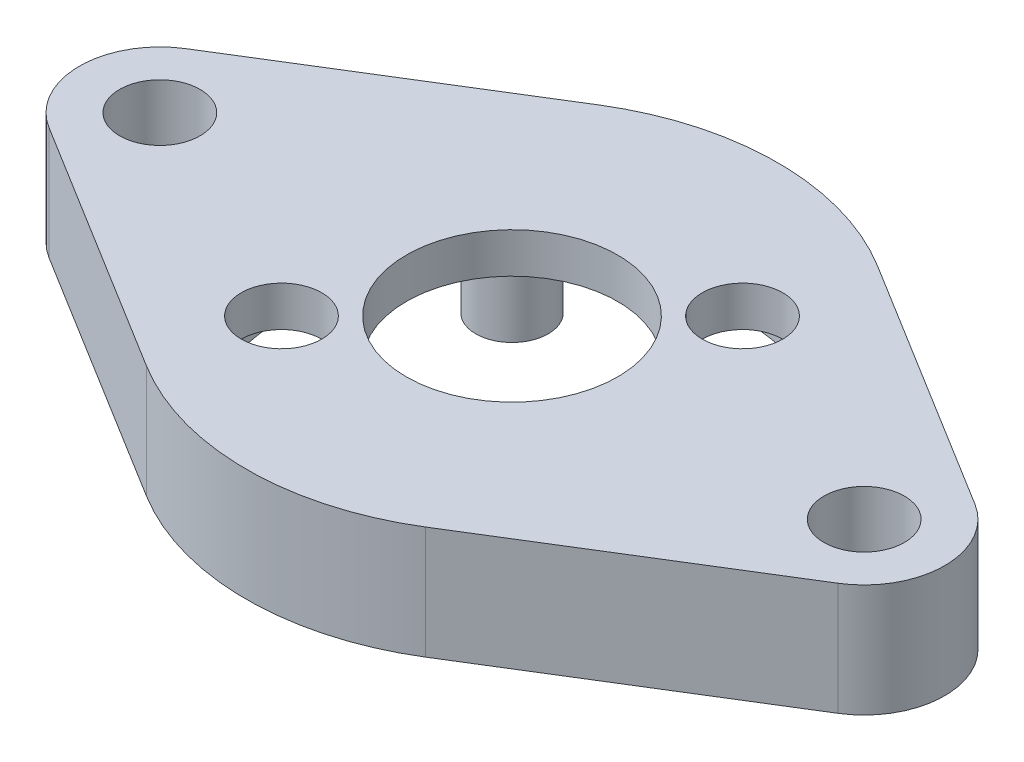
ISO-10303-21;
HEADER;
FILE_DESCRIPTION(('STEP AP214'),'2;1');
FILE_NAME('part.step','',(''),(''),'','','');
FILE_SCHEMA(('AUTOMOTIVE_DESIGN { 1 0 10303 214 1 1 1 1 }'));
ENDSEC;
DATA;
#1=APPLICATION_CONTEXT('core data for automotive mechanical design processes');
#2=APPLICATION_PROTOCOL_DEFINITION('international standard','automotive_design',2000,#1);
#3=PRODUCT_CONTEXT('',#1,'mechanical');
#4=PRODUCT('Part','Part','',(#3));
#5=PRODUCT_RELATED_PRODUCT_CATEGORY('part','',(#4));
#6=PRODUCT_DEFINITION_FORMATION('','',#4);
#7=PRODUCT_DEFINITION_CONTEXT('part definition',#1,'design');
#8=PRODUCT_DEFINITION('design','',#6,#7);
#9=PRODUCT_DEFINITION_SHAPE('','',#8);
#10=(LENGTH_UNIT() NAMED_UNIT(*) SI_UNIT(.MILLI.,.METRE.));
#11=(NAMED_UNIT(*) PLANE_ANGLE_UNIT() SI_UNIT($,.RADIAN.));
#12=(NAMED_UNIT(*) SI_UNIT($,.STERADIAN.) SOLID_ANGLE_UNIT());
#13=UNCERTAINTY_MEASURE_WITH_UNIT(LENGTH_MEASURE(1.E-05),#10,'distance_accuracy_value','');
#14=(GEOMETRIC_REPRESENTATION_CONTEXT(3) GLOBAL_UNCERTAINTY_ASSIGNED_CONTEXT((#13)) GLOBAL_UNIT_ASSIGNED_CONTEXT((#10,
#11,#12)) REPRESENTATION_CONTEXT('',''));
#15=CARTESIAN_POINT('',(0.,0.,0.));
#16=DIRECTION('',(0.,0.,1.));
#17=DIRECTION('',(1.,0.,0.));
#18=AXIS2_PLACEMENT_3D('',#15,#16,#17);
#19=CARTESIAN_POINT('',(-6.93942857142857,3.6,-11.2287279378405));
#20=DIRECTION('',(0.525714285714285,0.,0.850661207412163));
#21=DIRECTION('',(0.850661207412163,0.,-0.525714285714285));
#22=AXIS2_PLACEMENT_3D('',#19,#20,#21);
#23=PLANE('',#22);
#24=DIRECTION('',(-0.850661207412163,0.,0.525714285714285));
#25=VECTOR('',#24,1.);
#26=CARTESIAN_POINT('',(-6.93942857142857,0.,-11.2287279378405));
#27=LINE('',#26,#25);
#28=CARTESIAN_POINT('',(-6.93942857142857,0.,-11.2287279378405));
#29=VERTEX_POINT('',#28);
#30=CARTESIAN_POINT('',(-19.6028571428572,0.,-3.40264482964865));
#31=VERTEX_POINT('',#30);
#32=EDGE_CURVE('E147',#29,#31,#27,.T.);
#33=ORIENTED_EDGE('',*,*,#32,.T.);
#34=DIRECTION('',(0.,-1.,0.));
#35=VECTOR('',#34,1.);
#36=CARTESIAN_POINT('',(-19.6028571428572,3.6,-3.40264482964865));
#37=LINE('',#36,#35);
#38=CARTESIAN_POINT('',(-19.6028571428572,5.6,-3.40264482964865));
#39=VERTEX_POINT('',#38);
#40=EDGE_CURVE('E109',#39,#31,#37,.T.);
#41=ORIENTED_EDGE('',*,*,#40,.F.);
#42=DIRECTION('',(-0.850661207412163,0.,0.525714285714285));
#43=VECTOR('',#42,1.);
#44=CARTESIAN_POINT('',(-6.93942857142857,5.6,-11.2287279378405));
#45=LINE('',#44,#43);
#46=CARTESIAN_POINT('',(-6.93942857142857,5.6,-11.2287279378405));
#47=VERTEX_POINT('',#46);
#48=EDGE_CURVE('E107',#47,#39,#45,.T.);
#49=ORIENTED_EDGE('',*,*,#48,.F.);
#50=DIRECTION('',(0.,-1.,0.));
#51=VECTOR('',#50,1.);
#52=CARTESIAN_POINT('',(-6.93942857142857,3.6,-11.2287279378405));
#53=LINE('',#52,#51);
#54=EDGE_CURVE('E96',#47,#29,#53,.T.);
#55=ORIENTED_EDGE('',*,*,#54,.T.);
#56=EDGE_LOOP('',(#33,#41,#49,#55));
#57=FACE_BOUND('',#56,.T.);
#58=ADVANCED_FACE('F36',(#57),#23,.F.);
#59=CARTESIAN_POINT('',(-17.5,3.6,0.));
#60=DIRECTION('',(0.,-1.,0.));
#61=DIRECTION('',(0.,0.,-1.));
#62=AXIS2_PLACEMENT_3D('',#59,#60,#61);
#63=CYLINDRICAL_SURFACE('',#62,4.);
#64=CARTESIAN_POINT('',(-17.5,0.,0.));
#65=DIRECTION('',(0.,1.,0.));
#66=DIRECTION('',(0.,0.,1.));
#67=AXIS2_PLACEMENT_3D('',#64,#65,#66);
#68=CIRCLE('',#67,4.);
#69=CARTESIAN_POINT('',(-19.6028571428571,0.,3.40264482964865));
#70=VERTEX_POINT('',#69);
#71=EDGE_CURVE('E149',#31,#70,#68,.T.);
#72=ORIENTED_EDGE('',*,*,#71,.T.);
#73=DIRECTION('',(0.,-1.,0.));
#74=VECTOR('',#73,1.);
#75=CARTESIAN_POINT('',(-19.6028571428571,3.6,3.40264482964865));
#76=LINE('',#75,#74);
#77=CARTESIAN_POINT('',(-19.6028571428571,5.6,3.40264482964865));
#78=VERTEX_POINT('',#77);
#79=EDGE_CURVE('E180',#78,#70,#76,.T.);
#80=ORIENTED_EDGE('',*,*,#79,.F.);
#81=CARTESIAN_POINT('',(-17.5,5.6,0.));
#82=DIRECTION('',(0.,1.,0.));
#83=DIRECTION('',(0.,0.,1.));
#84=AXIS2_PLACEMENT_3D('',#81,#82,#83);
#85=CIRCLE('',#84,4.);
#86=EDGE_CURVE('E113',#39,#78,#85,.T.);
#87=ORIENTED_EDGE('',*,*,#86,.F.);
#88=ORIENTED_EDGE('',*,*,#40,.T.);
#89=EDGE_LOOP('',(#72,#80,#87,#88));
#90=FACE_BOUND('',#89,.T.);
#91=ADVANCED_FACE('F257',(#90),#63,.T.);
#92=CARTESIAN_POINT('',(-6.93942857142857,3.6,11.2287279378405));
#93=DIRECTION('',(0.525714285714286,0.,-0.850661207412163));
#94=DIRECTION('',(-0.850661207412163,0.,-0.525714285714286));
#95=AXIS2_PLACEMENT_3D('',#92,#93,#94);
#96=PLANE('',#95);
#97=DIRECTION('',(0.850661207412163,0.,0.525714285714286));
#98=VECTOR('',#97,1.);
#99=CARTESIAN_POINT('',(-6.93942857142857,0.,11.2287279378405));
#100=LINE('',#99,#98);
#101=CARTESIAN_POINT('',(-6.93942857142857,0.,11.2287279378405));
#102=VERTEX_POINT('',#101);
#103=EDGE_CURVE('E151',#70,#102,#100,.T.);
#104=ORIENTED_EDGE('',*,*,#103,.T.);
#105=DIRECTION('',(0.,-1.,0.));
#106=VECTOR('',#105,1.);
#107=CARTESIAN_POINT('',(-6.93942857142857,3.6,11.2287279378405));
#108=LINE('',#107,#106);
#109=CARTESIAN_POINT('',(-6.93942857142857,5.6,11.2287279378405));
#110=VERTEX_POINT('',#109);
#111=EDGE_CURVE('E177',#110,#102,#108,.T.);
#112=ORIENTED_EDGE('',*,*,#111,.F.);
#113=DIRECTION('',(0.850661207412163,0.,0.525714285714285));
#114=VECTOR('',#113,1.);
#115=CARTESIAN_POINT('',(-19.6028571428571,5.6,3.40264482964865));
#116=LINE('',#115,#114);
#117=EDGE_CURVE('E129',#78,#110,#116,.T.);
#118=ORIENTED_EDGE('',*,*,#117,.F.);
#119=ORIENTED_EDGE('',*,*,#79,.T.);
#120=EDGE_LOOP('',(#104,#112,#118,#119));
#121=FACE_BOUND('',#120,.T.);
#122=ADVANCED_FACE('F261',(#121),#96,.F.);
#123=CARTESIAN_POINT('',(0.,3.6,0.));
#124=DIRECTION('',(0.,-1.,0.));
#125=DIRECTION('',(0.,0.,-1.));
#126=AXIS2_PLACEMENT_3D('',#123,#124,#125);
#127=CYLINDRICAL_SURFACE('',#126,13.2);
#128=CARTESIAN_POINT('',(0.,0.,0.));
#129=DIRECTION('',(0.,1.,0.));
#130=DIRECTION('',(0.,0.,1.));
#131=AXIS2_PLACEMENT_3D('',#128,#129,#130);
#132=CIRCLE('',#131,13.2);
#133=CARTESIAN_POINT('',(6.93942857142857,0.,11.2287279378405));
#134=VERTEX_POINT('',#133);
#135=EDGE_CURVE('E153',#102,#134,#132,.T.);
#136=ORIENTED_EDGE('',*,*,#135,.T.);
#137=DIRECTION('',(0.,-1.,0.));
#138=VECTOR('',#137,1.);
#139=CARTESIAN_POINT('',(6.93942857142857,3.6,11.2287279378405));
#140=LINE('',#139,#138);
#141=CARTESIAN_POINT('',(6.93942857142857,5.6,11.2287279378405));
#142=VERTEX_POINT('',#141);
#143=EDGE_CURVE('E175',#142,#134,#140,.T.);
#144=ORIENTED_EDGE('',*,*,#143,.F.);
#145=CARTESIAN_POINT('',(0.,5.6,0.));
#146=DIRECTION('',(0.,1.,0.));
#147=DIRECTION('',(0.,0.,1.));
#148=AXIS2_PLACEMENT_3D('',#145,#146,#147);
#149=CIRCLE('',#148,13.2);
#150=EDGE_CURVE('E132',#110,#142,#149,.T.);
#151=ORIENTED_EDGE('',*,*,#150,.F.);
#152=ORIENTED_EDGE('',*,*,#111,.T.);
#153=EDGE_LOOP('',(#136,#144,#151,#152));
#154=FACE_BOUND('',#153,.T.);
#155=ADVANCED_FACE('F267',(#154),#127,.T.);
#156=CARTESIAN_POINT('',(6.93942857142857,3.6,11.2287279378405));
#157=DIRECTION('',(0.525714285714286,0.,0.850661207412163));
#158=DIRECTION('',(0.850661207412163,0.,-0.525714285714286));
#159=AXIS2_PLACEMENT_3D('',#156,#157,#158);
#160=PLANE('',#159);
#161=DIRECTION('',(-0.850661207412163,0.,0.525714285714286));
#162=VECTOR('',#161,1.);
#163=CARTESIAN_POINT('',(6.93942857142857,0.,11.2287279378405));
#164=LINE('',#163,#162);
#165=CARTESIAN_POINT('',(19.6028571428571,0.,3.40264482964865));
#166=VERTEX_POINT('',#165);
#167=EDGE_CURVE('E156',#166,#134,#164,.T.);
#168=ORIENTED_EDGE('',*,*,#167,.F.);
#169=DIRECTION('',(0.,-1.,0.));
#170=VECTOR('',#169,1.);
#171=CARTESIAN_POINT('',(19.6028571428571,3.6,3.40264482964865));
#172=LINE('',#171,#170);
#173=CARTESIAN_POINT('',(19.6028571428571,5.6,3.40264482964865));
#174=VERTEX_POINT('',#173);
#175=EDGE_CURVE('E173',#174,#166,#172,.T.);
#176=ORIENTED_EDGE('',*,*,#175,.F.);
#177=DIRECTION('',(0.850661207412163,0.,-0.525714285714286));
#178=VECTOR('',#177,1.);
#179=CARTESIAN_POINT('',(6.93942857142857,5.6,11.2287279378406));
#180=LINE('',#179,#178);
#181=EDGE_CURVE('E135',#142,#174,#180,.T.);
#182=ORIENTED_EDGE('',*,*,#181,.F.);
#183=ORIENTED_EDGE('',*,*,#143,.T.);
#184=EDGE_LOOP('',(#168,#176,#182,#183));
#185=FACE_BOUND('',#184,.T.);
#186=ADVANCED_FACE('F269',(#185),#160,.T.);
#187=CARTESIAN_POINT('',(17.5,3.6,0.));
#188=DIRECTION('',(0.,-1.,0.));
#189=DIRECTION('',(0.,0.,-1.));
#190=AXIS2_PLACEMENT_3D('',#187,#188,#189);
#191=CYLINDRICAL_SURFACE('',#190,4.);
#192=CARTESIAN_POINT('',(17.5,0.,0.));
#193=DIRECTION('',(0.,1.,0.));
#194=DIRECTION('',(0.,0.,1.));
#195=AXIS2_PLACEMENT_3D('',#192,#193,#194);
#196=CIRCLE('',#195,4.);
#197=CARTESIAN_POINT('',(19.6028571428572,0.,-3.40264482964865));
#198=VERTEX_POINT('',#197);
#199=EDGE_CURVE('E159',#198,#166,#196,.F.);
#200=ORIENTED_EDGE('',*,*,#199,.F.);
#201=DIRECTION('',(0.,-1.,0.));
#202=VECTOR('',#201,1.);
#203=CARTESIAN_POINT('',(19.6028571428572,3.6,-3.40264482964865));
#204=LINE('',#203,#202);
#205=CARTESIAN_POINT('',(19.6028571428572,5.6,-3.40264482964865));
#206=VERTEX_POINT('',#205);
#207=EDGE_CURVE('E171',#206,#198,#204,.T.);
#208=ORIENTED_EDGE('',*,*,#207,.F.);
#209=CARTESIAN_POINT('',(17.5,5.6,0.));
#210=DIRECTION('',(0.,1.,0.));
#211=DIRECTION('',(0.,0.,1.));
#212=AXIS2_PLACEMENT_3D('',#209,#210,#211);
#213=CIRCLE('',#212,4.);
#214=EDGE_CURVE('E138',#174,#206,#213,.T.);
#215=ORIENTED_EDGE('',*,*,#214,.F.);
#216=ORIENTED_EDGE('',*,*,#175,.T.);
#217=EDGE_LOOP('',(#200,#208,#215,#216));
#218=FACE_BOUND('',#217,.T.);
#219=ADVANCED_FACE('F272',(#218),#191,.T.);
#220=CARTESIAN_POINT('',(6.93942857142857,3.6,-11.2287279378405));
#221=DIRECTION('',(0.525714285714285,0.,-0.850661207412163));
#222=DIRECTION('',(-0.850661207412163,0.,-0.525714285714285));
#223=AXIS2_PLACEMENT_3D('',#220,#221,#222);
#224=PLANE('',#223);
#225=DIRECTION('',(0.850661207412163,0.,0.525714285714285));
#226=VECTOR('',#225,1.);
#227=CARTESIAN_POINT('',(6.93942857142857,0.,-11.2287279378405));
#228=LINE('',#227,#226);
#229=CARTESIAN_POINT('',(6.93942857142857,0.,-11.2287279378405));
#230=VERTEX_POINT('',#229);
#231=EDGE_CURVE('E162',#230,#198,#228,.T.);
#232=ORIENTED_EDGE('',*,*,#231,.F.);
#233=DIRECTION('',(0.,-1.,0.));
#234=VECTOR('',#233,1.);
#235=CARTESIAN_POINT('',(6.93942857142857,3.6,-11.2287279378405));
#236=LINE('',#235,#234);
#237=CARTESIAN_POINT('',(6.93942857142857,5.6,-11.2287279378405));
#238=VERTEX_POINT('',#237);
#239=EDGE_CURVE('E56',#238,#230,#236,.T.);
#240=ORIENTED_EDGE('',*,*,#239,.F.);
#241=DIRECTION('',(-0.850661207412163,0.,-0.525714285714286));
#242=VECTOR('',#241,1.);
#243=CARTESIAN_POINT('',(19.6028571428572,5.6,-3.40264482964865));
#244=LINE('',#243,#242);
#245=EDGE_CURVE('E120',#206,#238,#244,.T.);
#246=ORIENTED_EDGE('',*,*,#245,.F.);
#247=ORIENTED_EDGE('',*,*,#207,.T.);
#248=EDGE_LOOP('',(#232,#240,#246,#247));
#249=FACE_BOUND('',#248,.T.);
#250=ADVANCED_FACE('F211',(#249),#224,.T.);
#251=CARTESIAN_POINT('',(0.,3.6,0.));
#252=DIRECTION('',(0.,-1.,0.));
#253=DIRECTION('',(0.,0.,-1.));
#254=AXIS2_PLACEMENT_3D('',#251,#252,#253);
#255=CYLINDRICAL_SURFACE('',#254,11.2);
#256=CARTESIAN_POINT('',(0.,3.6,0.));
#257=DIRECTION('',(0.,1.,0.));
#258=DIRECTION('',(0.,0.,1.));
#259=AXIS2_PLACEMENT_3D('',#256,#257,#258);
#260=CIRCLE('',#259,11.2);
#261=CARTESIAN_POINT('',(0.,3.6,11.2));
#262=VERTEX_POINT('',#261);
#263=EDGE_CURVE('E141',#262,#262,#260,.T.);
#264=ORIENTED_EDGE('',*,*,#263,.T.);
#265=EDGE_LOOP('',(#264));
#266=FACE_BOUND('',#265,.T.);
#267=CARTESIAN_POINT('',(0.,0.,0.));
#268=DIRECTION('',(0.,1.,0.));
#269=DIRECTION('',(0.,0.,1.));
#270=AXIS2_PLACEMENT_3D('',#267,#268,#269);
#271=CIRCLE('',#270,11.2);
#272=CARTESIAN_POINT('',(0.,0.,11.2));
#273=VERTEX_POINT('',#272);
#274=EDGE_CURVE('E165',#273,#273,#271,.T.);
#275=ORIENTED_EDGE('',*,*,#274,.F.);
#276=EDGE_LOOP('',(#275));
#277=FACE_BOUND('',#276,.T.);
#278=ADVANCED_FACE('F208',(#266,#277),#255,.F.);
#279=EDGE_CURVE('E51',#230,#29,#132,.T.);
#280=ORIENTED_EDGE('',*,*,#279,.T.);
#281=ORIENTED_EDGE('',*,*,#54,.F.);
#282=CARTESIAN_POINT('',(0.,5.6,0.));
#283=DIRECTION('',(0.,1.,0.));
#284=DIRECTION('',(0.,0.,1.));
#285=AXIS2_PLACEMENT_3D('',#282,#283,#284);
#286=CIRCLE('',#285,13.2);
#287=EDGE_CURVE('E100',#238,#47,#286,.T.);
#288=ORIENTED_EDGE('',*,*,#287,.F.);
#289=ORIENTED_EDGE('',*,*,#239,.T.);
#290=EDGE_LOOP('',(#280,#281,#288,#289));
#291=FACE_BOUND('',#290,.T.);
#292=ADVANCED_FACE('F98',(#291),#127,.T.);
#293=CARTESIAN_POINT('',(-17.5,3.6,0.));
#294=DIRECTION('',(0.,-1.,0.));
#295=DIRECTION('',(0.,0.,-1.));
#296=AXIS2_PLACEMENT_3D('',#293,#294,#295);
#297=CYLINDRICAL_SURFACE('',#296,2.);
#298=CARTESIAN_POINT('',(-17.5,0.,0.));
#299=DIRECTION('',(0.,1.,0.));
#300=DIRECTION('',(0.,0.,1.));
#301=AXIS2_PLACEMENT_3D('',#298,#299,#300);
#302=CIRCLE('',#301,2.);
#303=CARTESIAN_POINT('',(-17.5,0.,2.));
#304=VERTEX_POINT('',#303);
#305=EDGE_CURVE('E144',#304,#304,#302,.T.);
#306=ORIENTED_EDGE('',*,*,#305,.F.);
#307=EDGE_LOOP('',(#306));
#308=FACE_BOUND('',#307,.T.);
#309=CARTESIAN_POINT('',(-17.5,5.6,0.));
#310=DIRECTION('',(0.,1.,0.));
#311=DIRECTION('',(0.,0.,1.));
#312=AXIS2_PLACEMENT_3D('',#309,#310,#311);
#313=CIRCLE('',#312,2.);
#314=CARTESIAN_POINT('',(-17.5,5.6,2.));
#315=VERTEX_POINT('',#314);
#316=EDGE_CURVE('E233',#315,#315,#313,.T.);
#317=ORIENTED_EDGE('',*,*,#316,.T.);
#318=EDGE_LOOP('',(#317));
#319=FACE_BOUND('',#318,.T.);
#320=ADVANCED_FACE('F38',(#308,#319),#297,.F.);
#321=CARTESIAN_POINT('',(17.5,3.6,0.));
#322=DIRECTION('',(0.,-1.,0.));
#323=DIRECTION('',(0.,0.,-1.));
#324=AXIS2_PLACEMENT_3D('',#321,#322,#323);
#325=CYLINDRICAL_SURFACE('',#324,2.);
#326=CARTESIAN_POINT('',(17.5,0.,0.));
#327=DIRECTION('',(0.,1.,0.));
#328=DIRECTION('',(0.,0.,1.));
#329=AXIS2_PLACEMENT_3D('',#326,#327,#328);
#330=CIRCLE('',#329,2.);
#331=CARTESIAN_POINT('',(17.5,0.,2.));
#332=VERTEX_POINT('',#331);
#333=EDGE_CURVE('E104',#332,#332,#330,.F.);
#334=ORIENTED_EDGE('',*,*,#333,.T.);
#335=EDGE_LOOP('',(#334));
#336=FACE_BOUND('',#335,.T.);
#337=CARTESIAN_POINT('',(17.5,5.6,0.));
#338=DIRECTION('',(0.,1.,0.));
#339=DIRECTION('',(0.,0.,1.));
#340=AXIS2_PLACEMENT_3D('',#337,#338,#339);
#341=CIRCLE('',#340,2.);
#342=CARTESIAN_POINT('',(17.5,5.6,2.));
#343=VERTEX_POINT('',#342);
#344=EDGE_CURVE('E121',#343,#343,#341,.T.);
#345=ORIENTED_EDGE('',*,*,#344,.T.);
#346=EDGE_LOOP('',(#345));
#347=FACE_BOUND('',#346,.T.);
#348=ADVANCED_FACE('F217',(#336,#347),#325,.F.);
#349=CARTESIAN_POINT('',(0.,0.,0.));
#350=DIRECTION('',(0.,1.,0.));
#351=DIRECTION('',(0.,0.,1.));
#352=AXIS2_PLACEMENT_3D('',#349,#350,#351);
#353=PLANE('',#352);
#354=ORIENTED_EDGE('',*,*,#305,.T.);
#355=EDGE_LOOP('',(#354));
#356=FACE_BOUND('',#355,.T.);
#357=ORIENTED_EDGE('',*,*,#32,.F.);
#358=ORIENTED_EDGE('',*,*,#279,.F.);
#359=ORIENTED_EDGE('',*,*,#231,.T.);
#360=ORIENTED_EDGE('',*,*,#199,.T.);
#361=ORIENTED_EDGE('',*,*,#167,.T.);
#362=ORIENTED_EDGE('',*,*,#135,.F.);
#363=ORIENTED_EDGE('',*,*,#103,.F.);
#364=ORIENTED_EDGE('',*,*,#71,.F.);
#365=EDGE_LOOP('',(#357,#358,#359,#360,#361,#362,#363,#364));
#366=FACE_BOUND('',#365,.T.);
#367=ORIENTED_EDGE('',*,*,#274,.T.);
#368=EDGE_LOOP('',(#367));
#369=FACE_BOUND('',#368,.T.);
#370=ORIENTED_EDGE('',*,*,#333,.F.);
#371=EDGE_LOOP('',(#370));
#372=FACE_BOUND('',#371,.T.);
#373=ADVANCED_FACE('F191',(#356,#366,#369,#372),#353,.F.);
#374=CARTESIAN_POINT('',(0.,3.6,0.));
#375=DIRECTION('',(0.,1.,0.));
#376=DIRECTION('',(0.,0.,1.));
#377=AXIS2_PLACEMENT_3D('',#374,#375,#376);
#378=PLANE('',#377);
#379=CARTESIAN_POINT('',(-5.72756492761103,3.6,-5.72756492761104));
#380=DIRECTION('',(0.,1.,0.));
#381=DIRECTION('',(0.,0.,1.));
#382=AXIS2_PLACEMENT_3D('',#379,#380,#381);
#383=CIRCLE('',#382,1.8);
#384=CARTESIAN_POINT('',(-5.72756492761103,3.6,-3.92756492761103));
#385=VERTEX_POINT('',#384);
#386=EDGE_CURVE('E11',#385,#385,#383,.F.);
#387=ORIENTED_EDGE('',*,*,#386,.F.);
#388=EDGE_LOOP('',(#387));
#389=FACE_BOUND('',#388,.T.);
#390=CARTESIAN_POINT('',(5.72756492761103,3.6,5.72756492761104));
#391=DIRECTION('',(0.,1.,0.));
#392=DIRECTION('',(0.,0.,1.));
#393=AXIS2_PLACEMENT_3D('',#390,#391,#392);
#394=CIRCLE('',#393,1.8);
#395=CARTESIAN_POINT('',(5.72756492761103,3.6,7.52756492761104));
#396=VERTEX_POINT('',#395);
#397=EDGE_CURVE('E44',#396,#396,#394,.F.);
#398=ORIENTED_EDGE('',*,*,#397,.F.);
#399=EDGE_LOOP('',(#398));
#400=FACE_BOUND('',#399,.T.);
#401=CARTESIAN_POINT('',(5.72756492761104,3.6,-5.72756492761103));
#402=DIRECTION('',(0.,1.,0.));
#403=DIRECTION('',(0.,0.,1.));
#404=AXIS2_PLACEMENT_3D('',#401,#402,#403);
#405=CIRCLE('',#404,2.);
#406=CARTESIAN_POINT('',(5.72756492761104,3.6,-3.72756492761103));
#407=VERTEX_POINT('',#406);
#408=EDGE_CURVE('E197',#407,#407,#405,.T.);
#409=ORIENTED_EDGE('',*,*,#408,.T.);
#410=EDGE_LOOP('',(#409));
#411=FACE_BOUND('',#410,.T.);
#412=CARTESIAN_POINT('',(-5.72756492761103,3.6,5.72756492761104));
#413=DIRECTION('',(0.,1.,0.));
#414=DIRECTION('',(0.,0.,1.));
#415=AXIS2_PLACEMENT_3D('',#412,#413,#414);
#416=CIRCLE('',#415,2.);
#417=CARTESIAN_POINT('',(-5.72756492761103,3.6,7.72756492761104));
#418=VERTEX_POINT('',#417);
#419=EDGE_CURVE('E201',#418,#418,#416,.T.);
#420=ORIENTED_EDGE('',*,*,#419,.T.);
#421=EDGE_LOOP('',(#420));
#422=FACE_BOUND('',#421,.T.);
#423=CARTESIAN_POINT('',(0.,3.6,0.));
#424=DIRECTION('',(0.,1.,0.));
#425=DIRECTION('',(0.,0.,1.));
#426=AXIS2_PLACEMENT_3D('',#423,#424,#425);
#427=CIRCLE('',#426,5.25);
#428=CARTESIAN_POINT('',(0.,3.6,5.25));
#429=VERTEX_POINT('',#428);
#430=EDGE_CURVE('E205',#429,#429,#427,.T.);
#431=ORIENTED_EDGE('',*,*,#430,.T.);
#432=EDGE_LOOP('',(#431));
#433=FACE_BOUND('',#432,.T.);
#434=ORIENTED_EDGE('',*,*,#263,.F.);
#435=EDGE_LOOP('',(#434));
#436=FACE_BOUND('',#435,.T.);
#437=ADVANCED_FACE('F188',(#389,#400,#411,#422,#433,#436),#378,.F.);
#438=CARTESIAN_POINT('',(0.,5.6,0.));
#439=DIRECTION('',(0.,1.,0.));
#440=DIRECTION('',(0.,0.,1.));
#441=AXIS2_PLACEMENT_3D('',#438,#439,#440);
#442=PLANE('',#441);
#443=CARTESIAN_POINT('',(5.72756492761104,5.6,-5.72756492761103));
#444=DIRECTION('',(0.,1.,0.));
#445=DIRECTION('',(0.,0.,1.));
#446=AXIS2_PLACEMENT_3D('',#443,#444,#445);
#447=CIRCLE('',#446,2.);
#448=CARTESIAN_POINT('',(5.72756492761104,5.6,-3.72756492761103));
#449=VERTEX_POINT('',#448);
#450=EDGE_CURVE('E236',#449,#449,#447,.T.);
#451=ORIENTED_EDGE('',*,*,#450,.F.);
#452=EDGE_LOOP('',(#451));
#453=FACE_BOUND('',#452,.T.);
#454=CARTESIAN_POINT('',(-5.72756492761103,5.6,5.72756492761104));
#455=DIRECTION('',(0.,1.,0.));
#456=DIRECTION('',(0.,0.,1.));
#457=AXIS2_PLACEMENT_3D('',#454,#455,#456);
#458=CIRCLE('',#457,2.);
#459=CARTESIAN_POINT('',(-5.72756492761103,5.6,7.72756492761104));
#460=VERTEX_POINT('',#459);
#461=EDGE_CURVE('E240',#460,#460,#458,.T.);
#462=ORIENTED_EDGE('',*,*,#461,.F.);
#463=EDGE_LOOP('',(#462));
#464=FACE_BOUND('',#463,.T.);
#465=CARTESIAN_POINT('',(0.,5.6,0.));
#466=DIRECTION('',(0.,1.,0.));
#467=DIRECTION('',(0.,0.,1.));
#468=AXIS2_PLACEMENT_3D('',#465,#466,#467);
#469=CIRCLE('',#468,5.25);
#470=CARTESIAN_POINT('',(0.,5.6,5.25));
#471=VERTEX_POINT('',#470);
#472=EDGE_CURVE('E124',#471,#471,#469,.T.);
#473=ORIENTED_EDGE('',*,*,#472,.F.);
#474=EDGE_LOOP('',(#473));
#475=FACE_BOUND('',#474,.T.);
#476=ORIENTED_EDGE('',*,*,#287,.T.);
#477=ORIENTED_EDGE('',*,*,#48,.T.);
#478=ORIENTED_EDGE('',*,*,#86,.T.);
#479=ORIENTED_EDGE('',*,*,#117,.T.);
#480=ORIENTED_EDGE('',*,*,#150,.T.);
#481=ORIENTED_EDGE('',*,*,#181,.T.);
#482=ORIENTED_EDGE('',*,*,#214,.T.);
#483=ORIENTED_EDGE('',*,*,#245,.T.);
#484=EDGE_LOOP('',(#476,#477,#478,#479,#480,#481,#482,#483));
#485=FACE_BOUND('',#484,.T.);
#486=ORIENTED_EDGE('',*,*,#344,.F.);
#487=EDGE_LOOP('',(#486));
#488=FACE_BOUND('',#487,.T.);
#489=ORIENTED_EDGE('',*,*,#316,.F.);
#490=EDGE_LOOP('',(#489));
#491=FACE_BOUND('',#490,.T.);
#492=ADVANCED_FACE('F116',(#453,#464,#475,#485,#488,#491),#442,.T.);
#493=CARTESIAN_POINT('',(0.,5.6,0.));
#494=DIRECTION('',(0.,-1.,0.));
#495=DIRECTION('',(0.,0.,-1.));
#496=AXIS2_PLACEMENT_3D('',#493,#494,#495);
#497=CYLINDRICAL_SURFACE('',#496,5.25);
#498=ORIENTED_EDGE('',*,*,#472,.T.);
#499=EDGE_LOOP('',(#498));
#500=FACE_BOUND('',#499,.T.);
#501=ORIENTED_EDGE('',*,*,#430,.F.);
#502=EDGE_LOOP('',(#501));
#503=FACE_BOUND('',#502,.T.);
#504=ADVANCED_FACE('F228',(#500,#503),#497,.F.);
#505=CARTESIAN_POINT('',(-5.72756492761103,3.6,5.72756492761104));
#506=DIRECTION('',(0.,1.,0.));
#507=DIRECTION('',(0.,0.,1.));
#508=AXIS2_PLACEMENT_3D('',#505,#506,#507);
#509=CYLINDRICAL_SURFACE('',#508,2.);
#510=ORIENTED_EDGE('',*,*,#419,.F.);
#511=EDGE_LOOP('',(#510));
#512=FACE_BOUND('',#511,.T.);
#513=ORIENTED_EDGE('',*,*,#461,.T.);
#514=EDGE_LOOP('',(#513));
#515=FACE_BOUND('',#514,.T.);
#516=ADVANCED_FACE('F248',(#512,#515),#509,.F.);
#517=CARTESIAN_POINT('',(5.72756492761104,3.6,-5.72756492761103));
#518=DIRECTION('',(0.,1.,0.));
#519=DIRECTION('',(0.,0.,1.));
#520=AXIS2_PLACEMENT_3D('',#517,#518,#519);
#521=CYLINDRICAL_SURFACE('',#520,2.);
#522=ORIENTED_EDGE('',*,*,#408,.F.);
#523=EDGE_LOOP('',(#522));
#524=FACE_BOUND('',#523,.T.);
#525=ORIENTED_EDGE('',*,*,#450,.T.);
#526=EDGE_LOOP('',(#525));
#527=FACE_BOUND('',#526,.T.);
#528=ADVANCED_FACE('F253',(#524,#527),#521,.F.);
#529=CARTESIAN_POINT('',(5.72756492761103,-5.09116882454314,5.72756492761104));
#530=DIRECTION('',(0.,1.,0.));
#531=DIRECTION('',(0.,0.,1.));
#532=AXIS2_PLACEMENT_3D('',#529,#530,#531);
#533=CYLINDRICAL_SURFACE('',#532,1.8);
#534=CARTESIAN_POINT('',(5.72756492761103,0.,5.72756492761104));
#535=DIRECTION('',(0.,1.,0.));
#536=DIRECTION('',(0.,0.,1.));
#537=AXIS2_PLACEMENT_3D('',#534,#535,#536);
#538=CIRCLE('',#537,1.8);
#539=CARTESIAN_POINT('',(5.72756492761103,0.,7.52756492761104));
#540=VERTEX_POINT('',#539);
#541=EDGE_CURVE('E462',#540,#540,#538,.T.);
#542=ORIENTED_EDGE('',*,*,#541,.T.);
#543=EDGE_LOOP('',(#542));
#544=FACE_BOUND('',#543,.T.);
#545=ORIENTED_EDGE('',*,*,#397,.T.);
#546=EDGE_LOOP('',(#545));
#547=FACE_BOUND('',#546,.T.);
#548=ADVANCED_FACE('F186',(#544,#547),#533,.T.);
#549=CARTESIAN_POINT('',(0.,0.,0.));
#550=DIRECTION('',(0.,1.,0.));
#551=DIRECTION('',(0.,0.,1.));
#552=AXIS2_PLACEMENT_3D('',#549,#550,#551);
#553=PLANE('',#552);
#554=ORIENTED_EDGE('',*,*,#541,.F.);
#555=EDGE_LOOP('',(#554));
#556=FACE_BOUND('',#555,.T.);
#557=ADVANCED_FACE('F424',(#556),#553,.F.);
#558=CARTESIAN_POINT('',(-5.72756492761103,-5.09116882454314,-5.72756492761104));
#559=DIRECTION('',(0.,1.,0.));
#560=DIRECTION('',(0.,0.,1.));
#561=AXIS2_PLACEMENT_3D('',#558,#559,#560);
#562=CYLINDRICAL_SURFACE('',#561,1.8);
#563=CARTESIAN_POINT('',(-5.72756492761103,0.,-5.72756492761104));
#564=DIRECTION('',(0.,1.,0.));
#565=DIRECTION('',(0.,0.,1.));
#566=AXIS2_PLACEMENT_3D('',#563,#564,#565);
#567=CIRCLE('',#566,1.8);
#568=CARTESIAN_POINT('',(-5.72756492761103,0.,-3.92756492761103));
#569=VERTEX_POINT('',#568);
#570=EDGE_CURVE('E461',#569,#569,#567,.T.);
#571=ORIENTED_EDGE('',*,*,#570,.T.);
#572=EDGE_LOOP('',(#571));
#573=FACE_BOUND('',#572,.T.);
#574=ORIENTED_EDGE('',*,*,#386,.T.);
#575=EDGE_LOOP('',(#574));
#576=FACE_BOUND('',#575,.T.);
#577=ADVANCED_FACE('F433',(#573,#576),#562,.T.);
#578=CARTESIAN_POINT('',(0.,0.,0.));
#579=DIRECTION('',(0.,1.,0.));
#580=DIRECTION('',(0.,0.,1.));
#581=AXIS2_PLACEMENT_3D('',#578,#579,#580);
#582=PLANE('',#581);
#583=ORIENTED_EDGE('',*,*,#570,.F.);
#584=EDGE_LOOP('',(#583));
#585=FACE_BOUND('',#584,.T.);
#586=ADVANCED_FACE('F442',(#585),#582,.F.);
#587=CLOSED_SHELL('',(#58,#91,#122,#155,#186,#219,#250,#278,#292,#320,#348,#373,#437,#492,#504,
#516,#528,#548,#557,#577,#586));
#588=MANIFOLD_SOLID_BREP('B2',#587);
#589=ADVANCED_BREP_SHAPE_REPRESENTATION('',(#18,#588),#14);
#590=SHAPE_DEFINITION_REPRESENTATION(#9,#589);
ENDSEC;
END-ISO-10303-21;
